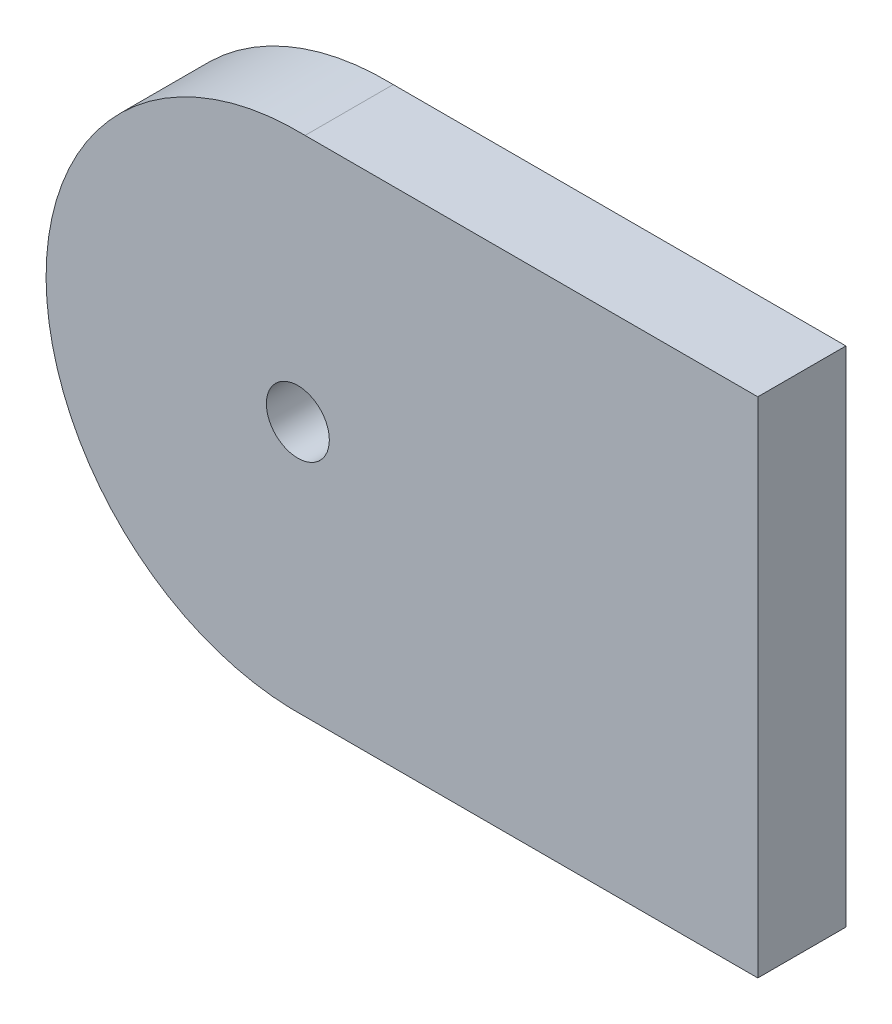
ISO-10303-21;
HEADER;
FILE_DESCRIPTION(('STEP AP214'),'2;1');
FILE_NAME('part.step','',(''),(''),'','','');
FILE_SCHEMA(('AUTOMOTIVE_DESIGN { 1 0 10303 214 1 1 1 1 }'));
ENDSEC;
DATA;
#1=APPLICATION_CONTEXT('core data for automotive mechanical design processes');
#2=APPLICATION_PROTOCOL_DEFINITION('international standard','automotive_design',2000,#1);
#3=PRODUCT_CONTEXT('',#1,'mechanical');
#4=PRODUCT('Part','Part','',(#3));
#5=PRODUCT_RELATED_PRODUCT_CATEGORY('part','',(#4));
#6=PRODUCT_DEFINITION_FORMATION('','',#4);
#7=PRODUCT_DEFINITION_CONTEXT('part definition',#1,'design');
#8=PRODUCT_DEFINITION('design','',#6,#7);
#9=PRODUCT_DEFINITION_SHAPE('','',#8);
#10=(LENGTH_UNIT() NAMED_UNIT(*) SI_UNIT(.MILLI.,.METRE.));
#11=(NAMED_UNIT(*) PLANE_ANGLE_UNIT() SI_UNIT($,.RADIAN.));
#12=(NAMED_UNIT(*) SI_UNIT($,.STERADIAN.) SOLID_ANGLE_UNIT());
#13=UNCERTAINTY_MEASURE_WITH_UNIT(LENGTH_MEASURE(1.E-05),#10,'distance_accuracy_value','');
#14=(GEOMETRIC_REPRESENTATION_CONTEXT(3) GLOBAL_UNCERTAINTY_ASSIGNED_CONTEXT((#13)) GLOBAL_UNIT_ASSIGNED_CONTEXT((#10,
#11,#12)) REPRESENTATION_CONTEXT('',''));
#15=CARTESIAN_POINT('',(0.,0.,0.));
#16=DIRECTION('',(0.,0.,1.));
#17=DIRECTION('',(1.,0.,0.));
#18=AXIS2_PLACEMENT_3D('',#15,#16,#17);
#19=CARTESIAN_POINT('',(0.,0.,-8.89));
#20=DIRECTION('',(0.,0.,1.));
#21=DIRECTION('',(1.,0.,0.));
#22=AXIS2_PLACEMENT_3D('',#19,#20,#21);
#23=CYLINDRICAL_SURFACE('',#22,50.8);
#24=DIRECTION('',(0.,0.,1.));
#25=VECTOR('',#24,1.);
#26=CARTESIAN_POINT('',(-1.45864428903891,-50.7790543121675,-8.89));
#27=LINE('',#26,#25);
#28=CARTESIAN_POINT('',(-1.45864428903891,-50.7790543121675,-8.89));
#29=VERTEX_POINT('',#28);
#30=CARTESIAN_POINT('',(-1.45864428903891,-50.7790543121675,8.89));
#31=VERTEX_POINT('',#30);
#32=EDGE_CURVE('E48',#29,#31,#27,.T.);
#33=ORIENTED_EDGE('',*,*,#32,.T.);
#34=CARTESIAN_POINT('',(0.,0.,8.89));
#35=DIRECTION('',(0.,0.,1.));
#36=DIRECTION('',(1.,0.,0.));
#37=AXIS2_PLACEMENT_3D('',#34,#35,#36);
#38=CIRCLE('',#37,50.8);
#39=CARTESIAN_POINT('',(1.45864428903891,50.7790543121675,8.89));
#40=VERTEX_POINT('',#39);
#41=EDGE_CURVE('E120',#40,#31,#38,.T.);
#42=ORIENTED_EDGE('',*,*,#41,.F.);
#43=DIRECTION('',(0.,0.,1.));
#44=VECTOR('',#43,1.);
#45=CARTESIAN_POINT('',(1.45864428903891,50.7790543121675,-8.89));
#46=LINE('',#45,#44);
#47=CARTESIAN_POINT('',(1.45864428903891,50.7790543121675,-8.89));
#48=VERTEX_POINT('',#47);
#49=EDGE_CURVE('E11',#48,#40,#46,.T.);
#50=ORIENTED_EDGE('',*,*,#49,.F.);
#51=CARTESIAN_POINT('',(0.,0.,-8.89));
#52=DIRECTION('',(0.,0.,1.));
#53=DIRECTION('',(1.,0.,0.));
#54=AXIS2_PLACEMENT_3D('',#51,#52,#53);
#55=CIRCLE('',#54,50.8);
#56=EDGE_CURVE('E89',#48,#29,#55,.T.);
#57=ORIENTED_EDGE('',*,*,#56,.T.);
#58=EDGE_LOOP('',(#33,#42,#50,#57));
#59=FACE_BOUND('',#58,.T.);
#60=ADVANCED_FACE('F45',(#59),#23,.T.);
#61=CARTESIAN_POINT('',(1.45864428903891,50.7790543121675,-8.89));
#62=DIRECTION('',(0.,1.,0.));
#63=DIRECTION('',(0.,0.,1.));
#64=AXIS2_PLACEMENT_3D('',#61,#62,#63);
#65=PLANE('',#64);
#66=ORIENTED_EDGE('',*,*,#49,.T.);
#67=DIRECTION('',(-1.,0.,0.));
#68=VECTOR('',#67,1.);
#69=CARTESIAN_POINT('',(1.45864428903891,50.7790543121675,8.89));
#70=LINE('',#69,#68);
#71=CARTESIAN_POINT('',(92.8033247277291,50.7790543121675,8.89));
#72=VERTEX_POINT('',#71);
#73=EDGE_CURVE('E98',#72,#40,#70,.T.);
#74=ORIENTED_EDGE('',*,*,#73,.F.);
#75=DIRECTION('',(0.,0.,1.));
#76=VECTOR('',#75,1.);
#77=CARTESIAN_POINT('',(92.8033247277291,50.7790543121675,8.89));
#78=LINE('',#77,#76);
#79=CARTESIAN_POINT('',(92.8033247277291,50.7790543121675,-8.89));
#80=VERTEX_POINT('',#79);
#81=EDGE_CURVE('E95',#80,#72,#78,.T.);
#82=ORIENTED_EDGE('',*,*,#81,.F.);
#83=DIRECTION('',(-1.,0.,0.));
#84=VECTOR('',#83,1.);
#85=CARTESIAN_POINT('',(1.45864428903891,50.7790543121675,-8.89));
#86=LINE('',#85,#84);
#87=EDGE_CURVE('E84',#80,#48,#86,.T.);
#88=ORIENTED_EDGE('',*,*,#87,.T.);
#89=EDGE_LOOP('',(#66,#74,#82,#88));
#90=FACE_BOUND('',#89,.T.);
#91=ADVANCED_FACE('F96',(#90),#65,.T.);
#92=CARTESIAN_POINT('',(16.6033247277291,-50.7790543121675,-8.89));
#93=DIRECTION('',(0.,-1.,0.));
#94=DIRECTION('',(1.,0.,0.));
#95=AXIS2_PLACEMENT_3D('',#92,#93,#94);
#96=PLANE('',#95);
#97=DIRECTION('',(1.,0.,0.));
#98=VECTOR('',#97,1.);
#99=CARTESIAN_POINT('',(16.6033247277291,-50.7790543121675,-8.89));
#100=LINE('',#99,#98);
#101=CARTESIAN_POINT('',(92.8033247277291,-50.7790543121675,-8.89));
#102=VERTEX_POINT('',#101);
#103=EDGE_CURVE('E92',#29,#102,#100,.T.);
#104=ORIENTED_EDGE('',*,*,#103,.T.);
#105=DIRECTION('',(0.,0.,-1.));
#106=VECTOR('',#105,1.);
#107=CARTESIAN_POINT('',(92.8033247277291,-50.7790543121675,8.89));
#108=LINE('',#107,#106);
#109=CARTESIAN_POINT('',(92.8033247277291,-50.7790543121675,8.89));
#110=VERTEX_POINT('',#109);
#111=EDGE_CURVE('E108',#110,#102,#108,.T.);
#112=ORIENTED_EDGE('',*,*,#111,.F.);
#113=DIRECTION('',(1.,0.,0.));
#114=VECTOR('',#113,1.);
#115=CARTESIAN_POINT('',(16.6033247277291,-50.7790543121675,8.89));
#116=LINE('',#115,#114);
#117=EDGE_CURVE('E124',#31,#110,#116,.T.);
#118=ORIENTED_EDGE('',*,*,#117,.F.);
#119=ORIENTED_EDGE('',*,*,#32,.F.);
#120=EDGE_LOOP('',(#104,#112,#118,#119));
#121=FACE_BOUND('',#120,.T.);
#122=ADVANCED_FACE('F136',(#121),#96,.T.);
#123=CARTESIAN_POINT('',(0.,0.,-8.89));
#124=DIRECTION('',(0.,0.,1.));
#125=DIRECTION('',(1.,0.,0.));
#126=AXIS2_PLACEMENT_3D('',#123,#124,#125);
#127=PLANE('',#126);
#128=CARTESIAN_POINT('',(0.,0.,-8.89));
#129=DIRECTION('',(0.,0.,1.));
#130=DIRECTION('',(1.,0.,0.));
#131=AXIS2_PLACEMENT_3D('',#128,#129,#130);
#132=CIRCLE('',#131,6.35);
#133=CARTESIAN_POINT('',(6.35,0.,-8.89));
#134=VERTEX_POINT('',#133);
#135=EDGE_CURVE('E129',#134,#134,#132,.T.);
#136=ORIENTED_EDGE('',*,*,#135,.T.);
#137=EDGE_LOOP('',(#136));
#138=FACE_BOUND('',#137,.T.);
#139=ORIENTED_EDGE('',*,*,#56,.F.);
#140=ORIENTED_EDGE('',*,*,#87,.F.);
#141=DIRECTION('',(0.,1.,0.));
#142=VECTOR('',#141,1.);
#143=CARTESIAN_POINT('',(92.8033247277291,-50.7790543121675,-8.89));
#144=LINE('',#143,#142);
#145=EDGE_CURVE('E88',#102,#80,#144,.T.);
#146=ORIENTED_EDGE('',*,*,#145,.F.);
#147=ORIENTED_EDGE('',*,*,#103,.F.);
#148=EDGE_LOOP('',(#139,#140,#146,#147));
#149=FACE_BOUND('',#148,.T.);
#150=ADVANCED_FACE('F86',(#138,#149),#127,.F.);
#151=CARTESIAN_POINT('',(0.,0.,-8.89));
#152=DIRECTION('',(0.,0.,1.));
#153=DIRECTION('',(1.,0.,0.));
#154=AXIS2_PLACEMENT_3D('',#151,#152,#153);
#155=CYLINDRICAL_SURFACE('',#154,6.35);
#156=ORIENTED_EDGE('',*,*,#135,.F.);
#157=EDGE_LOOP('',(#156));
#158=FACE_BOUND('',#157,.T.);
#159=CARTESIAN_POINT('',(0.,0.,8.89));
#160=DIRECTION('',(0.,0.,1.));
#161=DIRECTION('',(1.,0.,0.));
#162=AXIS2_PLACEMENT_3D('',#159,#160,#161);
#163=CIRCLE('',#162,6.35);
#164=CARTESIAN_POINT('',(6.35,0.,8.89));
#165=VERTEX_POINT('',#164);
#166=EDGE_CURVE('E116',#165,#165,#163,.T.);
#167=ORIENTED_EDGE('',*,*,#166,.T.);
#168=EDGE_LOOP('',(#167));
#169=FACE_BOUND('',#168,.T.);
#170=ADVANCED_FACE('F142',(#158,#169),#155,.F.);
#171=CARTESIAN_POINT('',(0.,0.,8.89));
#172=DIRECTION('',(0.,0.,1.));
#173=DIRECTION('',(1.,0.,0.));
#174=AXIS2_PLACEMENT_3D('',#171,#172,#173);
#175=PLANE('',#174);
#176=ORIENTED_EDGE('',*,*,#41,.T.);
#177=ORIENTED_EDGE('',*,*,#117,.T.);
#178=DIRECTION('',(0.,-1.,0.));
#179=VECTOR('',#178,1.);
#180=CARTESIAN_POINT('',(92.8033247277291,-50.7790543121675,8.89));
#181=LINE('',#180,#179);
#182=EDGE_CURVE('E103',#72,#110,#181,.T.);
#183=ORIENTED_EDGE('',*,*,#182,.F.);
#184=ORIENTED_EDGE('',*,*,#73,.T.);
#185=EDGE_LOOP('',(#176,#177,#183,#184));
#186=FACE_BOUND('',#185,.T.);
#187=ORIENTED_EDGE('',*,*,#166,.F.);
#188=EDGE_LOOP('',(#187));
#189=FACE_BOUND('',#188,.T.);
#190=ADVANCED_FACE('F139',(#186,#189),#175,.T.);
#191=CARTESIAN_POINT('',(92.8033247277291,0.,0.));
#192=DIRECTION('',(-1.,0.,0.));
#193=DIRECTION('',(0.,0.,1.));
#194=AXIS2_PLACEMENT_3D('',#191,#192,#193);
#195=PLANE('',#194);
#196=ORIENTED_EDGE('',*,*,#145,.T.);
#197=ORIENTED_EDGE('',*,*,#81,.T.);
#198=ORIENTED_EDGE('',*,*,#182,.T.);
#199=ORIENTED_EDGE('',*,*,#111,.T.);
#200=EDGE_LOOP('',(#196,#197,#198,#199));
#201=FACE_BOUND('',#200,.T.);
#202=ADVANCED_FACE('F106',(#201),#195,.F.);
#203=CLOSED_SHELL('',(#60,#91,#122,#150,#170,#190,#202));
#204=MANIFOLD_SOLID_BREP('B2',#203);
#205=ADVANCED_BREP_SHAPE_REPRESENTATION('',(#18,#204),#14);
#206=SHAPE_DEFINITION_REPRESENTATION(#9,#205);
ENDSEC;
END-ISO-10303-21;
